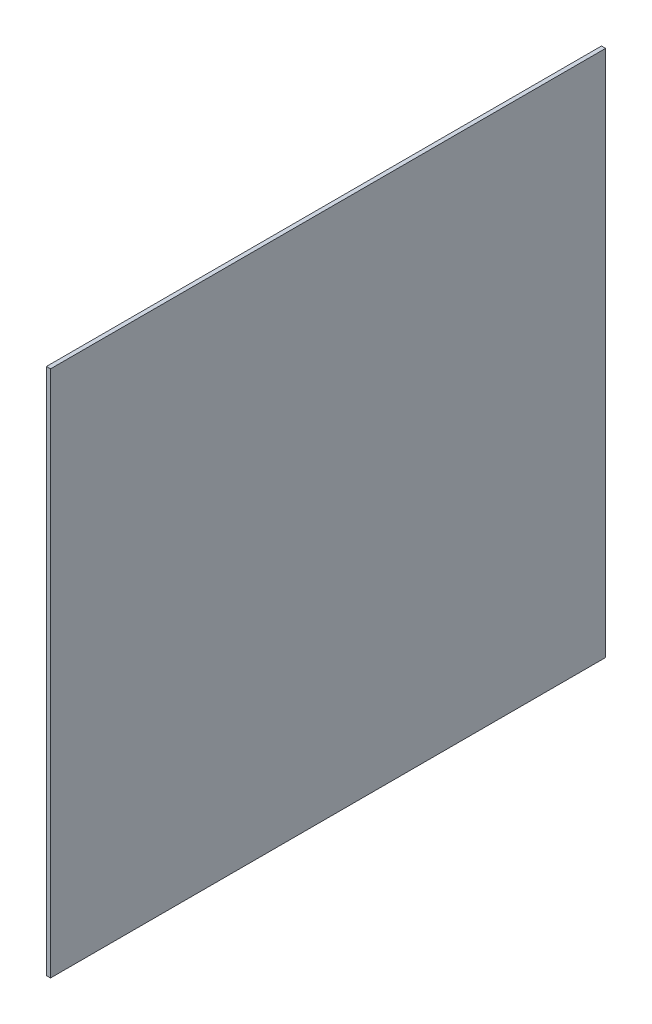
ISO-10303-21;
HEADER;
FILE_DESCRIPTION(('STEP AP214'),'2;1');
FILE_NAME('part.step','',(''),(''),'','','');
FILE_SCHEMA(('AUTOMOTIVE_DESIGN { 1 0 10303 214 1 1 1 1 }'));
ENDSEC;
DATA;
#1=APPLICATION_CONTEXT('core data for automotive mechanical design processes');
#2=APPLICATION_PROTOCOL_DEFINITION('international standard','automotive_design',2000,#1);
#3=PRODUCT_CONTEXT('',#1,'mechanical');
#4=PRODUCT('Part','Part','',(#3));
#5=PRODUCT_RELATED_PRODUCT_CATEGORY('part','',(#4));
#6=PRODUCT_DEFINITION_FORMATION('','',#4);
#7=PRODUCT_DEFINITION_CONTEXT('part definition',#1,'design');
#8=PRODUCT_DEFINITION('design','',#6,#7);
#9=PRODUCT_DEFINITION_SHAPE('','',#8);
#10=(LENGTH_UNIT() NAMED_UNIT(*) SI_UNIT(.MILLI.,.METRE.));
#11=(NAMED_UNIT(*) PLANE_ANGLE_UNIT() SI_UNIT($,.RADIAN.));
#12=(NAMED_UNIT(*) SI_UNIT($,.STERADIAN.) SOLID_ANGLE_UNIT());
#13=UNCERTAINTY_MEASURE_WITH_UNIT(LENGTH_MEASURE(1.E-05),#10,'distance_accuracy_value','');
#14=(GEOMETRIC_REPRESENTATION_CONTEXT(3) GLOBAL_UNCERTAINTY_ASSIGNED_CONTEXT((#13)) GLOBAL_UNIT_ASSIGNED_CONTEXT((#10,
#11,#12)) REPRESENTATION_CONTEXT('',''));
#15=CARTESIAN_POINT('',(0.,0.,0.));
#16=DIRECTION('',(0.,0.,1.));
#17=DIRECTION('',(1.,0.,0.));
#18=AXIS2_PLACEMENT_3D('',#15,#16,#17);
#19=CARTESIAN_POINT('',(331.999992370655,166.999999999983,156.903999999956));
#20=DIRECTION('',(1.,0.,0.));
#21=DIRECTION('',(0.,1.,0.));
#22=AXIS2_PLACEMENT_3D('',#19,#20,#21);
#23=PLANE('',#22);
#24=DIRECTION('',(0.,-1.,2.55099249257735E-13));
#25=VECTOR('',#24,1.);
#26=CARTESIAN_POINT('',(331.999992370655,351.999999999989,-45.0960000000917));
#27=LINE('',#26,#25);
#28=CARTESIAN_POINT('',(331.999992370655,358.99999999997,-45.0960000000935));
#29=VERTEX_POINT('',#28);
#30=CARTESIAN_POINT('',(331.999992370655,-25.0000000001071,-45.0959999999957));
#31=VERTEX_POINT('',#30);
#32=EDGE_CURVE('E27',#29,#31,#27,.T.);
#33=ORIENTED_EDGE('',*,*,#32,.T.);
#34=DIRECTION('',(0.,2.54947484509169E-13,1.));
#35=VECTOR('',#34,1.);
#36=CARTESIAN_POINT('',(331.999992370655,-25.0000000001073,-45.973354245283));
#37=LINE('',#36,#35);
#38=CARTESIAN_POINT('',(331.999992370655,-25.0000000000041,358.904000000005));
#39=VERTEX_POINT('',#38);
#40=EDGE_CURVE('E107',#31,#39,#37,.T.);
#41=ORIENTED_EDGE('',*,*,#40,.T.);
#42=DIRECTION('',(0.,1.,-2.60532405807183E-13));
#43=VECTOR('',#42,1.);
#44=CARTESIAN_POINT('',(331.999992370655,352.000000000092,358.903999999909));
#45=LINE('',#44,#43);
#46=CARTESIAN_POINT('',(331.999992370655,359.000000000074,358.903999999907));
#47=VERTEX_POINT('',#46);
#48=EDGE_CURVE('E87',#39,#47,#45,.T.);
#49=ORIENTED_EDGE('',*,*,#48,.T.);
#50=DIRECTION('',(0.,2.55319606700704E-13,1.));
#51=VECTOR('',#50,1.);
#52=CARTESIAN_POINT('',(331.999992370655,358.99999999997,-45.9733542453797));
#53=LINE('',#52,#51);
#54=EDGE_CURVE('E62',#29,#47,#53,.T.);
#55=ORIENTED_EDGE('',*,*,#54,.F.);
#56=EDGE_LOOP('',(#33,#41,#49,#55));
#57=FACE_BOUND('',#56,.T.);
#58=ADVANCED_FACE('F17',(#57),#23,.F.);
#59=CARTESIAN_POINT('',(334.999992370655,166.999999999983,156.903999999956));
#60=DIRECTION('',(1.,0.,0.));
#61=DIRECTION('',(0.,1.,0.));
#62=AXIS2_PLACEMENT_3D('',#59,#60,#61);
#63=PLANE('',#62);
#64=DIRECTION('',(0.,1.,-2.55099249257735E-13));
#65=VECTOR('',#64,1.);
#66=CARTESIAN_POINT('',(334.999992370655,351.999999999989,-45.0960000000917));
#67=LINE('',#66,#65);
#68=CARTESIAN_POINT('',(334.999992370655,-25.0000000001071,-45.0959999999957));
#69=VERTEX_POINT('',#68);
#70=CARTESIAN_POINT('',(334.999992370655,358.99999999997,-45.0960000000935));
#71=VERTEX_POINT('',#70);
#72=EDGE_CURVE('E11',#69,#71,#67,.T.);
#73=ORIENTED_EDGE('',*,*,#72,.T.);
#74=DIRECTION('',(0.,2.55319606700704E-13,1.));
#75=VECTOR('',#74,1.);
#76=CARTESIAN_POINT('',(334.999992370655,358.99999999997,-45.9733542453797));
#77=LINE('',#76,#75);
#78=CARTESIAN_POINT('',(334.999992370655,359.000000000074,358.903999999907));
#79=VERTEX_POINT('',#78);
#80=EDGE_CURVE('E67',#71,#79,#77,.T.);
#81=ORIENTED_EDGE('',*,*,#80,.T.);
#82=DIRECTION('',(0.,-1.,2.60532405807183E-13));
#83=VECTOR('',#82,1.);
#84=CARTESIAN_POINT('',(334.999992370655,352.000000000092,358.903999999909));
#85=LINE('',#84,#83);
#86=CARTESIAN_POINT('',(334.999992370655,-25.0000000000041,358.904000000005));
#87=VERTEX_POINT('',#86);
#88=EDGE_CURVE('E70',#79,#87,#85,.T.);
#89=ORIENTED_EDGE('',*,*,#88,.T.);
#90=DIRECTION('',(0.,-2.54947484509169E-13,-1.));
#91=VECTOR('',#90,1.);
#92=CARTESIAN_POINT('',(334.999992370655,-25.0000000001073,-45.973354245283));
#93=LINE('',#92,#91);
#94=EDGE_CURVE('E98',#87,#69,#93,.T.);
#95=ORIENTED_EDGE('',*,*,#94,.T.);
#96=EDGE_LOOP('',(#73,#81,#89,#95));
#97=FACE_BOUND('',#96,.T.);
#98=ADVANCED_FACE('F68',(#97),#63,.T.);
#99=CARTESIAN_POINT('',(331.999992370655,-25.0000000001071,-45.0959999999955));
#100=DIRECTION('',(0.,-2.55099249257735E-13,-1.));
#101=DIRECTION('',(0.,-1.,2.55099249257735E-13));
#102=AXIS2_PLACEMENT_3D('',#99,#100,#101);
#103=PLANE('',#102);
#104=ORIENTED_EDGE('',*,*,#32,.F.);
#105=DIRECTION('',(1.,0.,0.));
#106=VECTOR('',#105,1.);
#107=CARTESIAN_POINT('',(331.999992370655,358.99999999997,-45.0960000000935));
#108=LINE('',#107,#106);
#109=EDGE_CURVE('E73',#29,#71,#108,.T.);
#110=ORIENTED_EDGE('',*,*,#109,.T.);
#111=ORIENTED_EDGE('',*,*,#72,.F.);
#112=DIRECTION('',(1.,0.,0.));
#113=VECTOR('',#112,1.);
#114=CARTESIAN_POINT('',(331.999992370655,-25.0000000001071,-45.0959999999957));
#115=LINE('',#114,#113);
#116=EDGE_CURVE('E100',#31,#69,#115,.T.);
#117=ORIENTED_EDGE('',*,*,#116,.F.);
#118=EDGE_LOOP('',(#104,#110,#111,#117));
#119=FACE_BOUND('',#118,.T.);
#120=ADVANCED_FACE('F121',(#119),#103,.T.);
#121=CARTESIAN_POINT('',(331.999992370655,358.99999999997,-45.0960000000935));
#122=DIRECTION('',(0.,1.,-2.55319606700704E-13));
#123=DIRECTION('',(0.,-2.55319606700704E-13,-1.));
#124=AXIS2_PLACEMENT_3D('',#121,#122,#123);
#125=PLANE('',#124);
#126=ORIENTED_EDGE('',*,*,#54,.T.);
#127=DIRECTION('',(1.,0.,0.));
#128=VECTOR('',#127,1.);
#129=CARTESIAN_POINT('',(331.999992370655,359.000000000074,358.903999999907));
#130=LINE('',#129,#128);
#131=EDGE_CURVE('E75',#47,#79,#130,.T.);
#132=ORIENTED_EDGE('',*,*,#131,.T.);
#133=ORIENTED_EDGE('',*,*,#80,.F.);
#134=ORIENTED_EDGE('',*,*,#109,.F.);
#135=EDGE_LOOP('',(#126,#132,#133,#134));
#136=FACE_BOUND('',#135,.T.);
#137=ADVANCED_FACE('F76',(#136),#125,.T.);
#138=CARTESIAN_POINT('',(331.999992370655,359.000000000074,358.903999999907));
#139=DIRECTION('',(0.,2.60532405807183E-13,1.));
#140=DIRECTION('',(0.,-1.,2.60532405807183E-13));
#141=AXIS2_PLACEMENT_3D('',#138,#139,#140);
#142=PLANE('',#141);
#143=ORIENTED_EDGE('',*,*,#48,.F.);
#144=DIRECTION('',(1.,0.,0.));
#145=VECTOR('',#144,1.);
#146=CARTESIAN_POINT('',(331.999992370655,-25.0000000000041,358.904000000005));
#147=LINE('',#146,#145);
#148=EDGE_CURVE('E84',#39,#87,#147,.T.);
#149=ORIENTED_EDGE('',*,*,#148,.T.);
#150=ORIENTED_EDGE('',*,*,#88,.F.);
#151=ORIENTED_EDGE('',*,*,#131,.F.);
#152=EDGE_LOOP('',(#143,#149,#150,#151));
#153=FACE_BOUND('',#152,.T.);
#154=ADVANCED_FACE('F82',(#153),#142,.T.);
#155=CARTESIAN_POINT('',(331.999992370655,-25.0000000000041,358.904000000005));
#156=DIRECTION('',(0.,-1.,2.54947484509169E-13));
#157=DIRECTION('',(-1.,0.,0.));
#158=AXIS2_PLACEMENT_3D('',#155,#156,#157);
#159=PLANE('',#158);
#160=ORIENTED_EDGE('',*,*,#40,.F.);
#161=ORIENTED_EDGE('',*,*,#116,.T.);
#162=ORIENTED_EDGE('',*,*,#94,.F.);
#163=ORIENTED_EDGE('',*,*,#148,.F.);
#164=EDGE_LOOP('',(#160,#161,#162,#163));
#165=FACE_BOUND('',#164,.T.);
#166=ADVANCED_FACE('F19',(#165),#159,.T.);
#167=CLOSED_SHELL('',(#58,#98,#120,#137,#154,#166));
#168=MANIFOLD_SOLID_BREP('B1',#167);
#169=ADVANCED_BREP_SHAPE_REPRESENTATION('',(#18,#168),#14);
#170=SHAPE_DEFINITION_REPRESENTATION(#9,#169);
ENDSEC;
END-ISO-10303-21;
